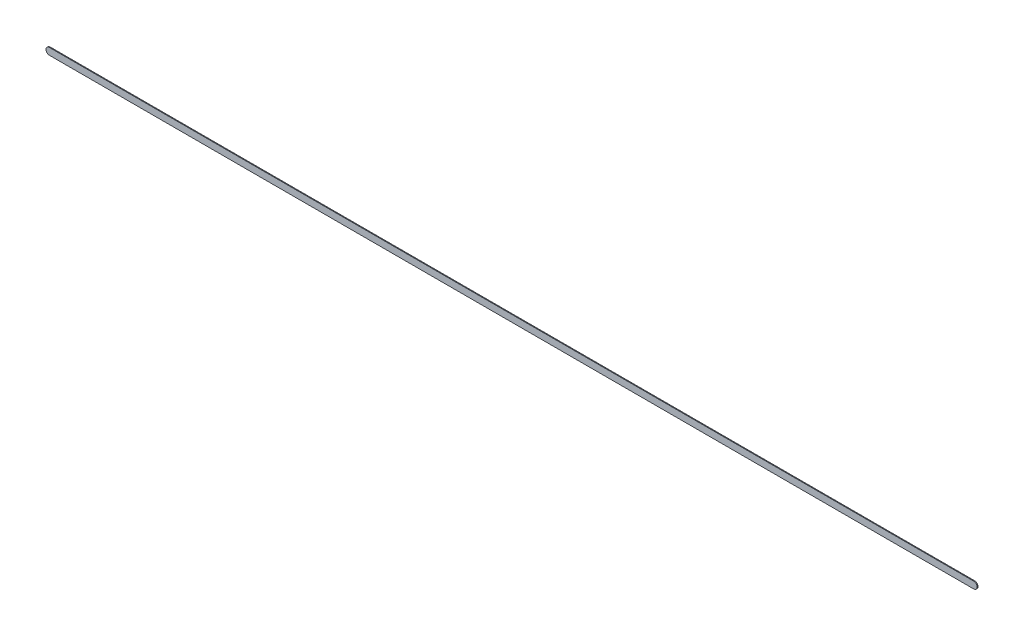
ISO-10303-21;
HEADER;
FILE_DESCRIPTION(('STEP AP214'),'2;1');
FILE_NAME('part.step','',(''),(''),'','','');
FILE_SCHEMA(('AUTOMOTIVE_DESIGN { 1 0 10303 214 1 1 1 1 }'));
ENDSEC;
DATA;
#1=APPLICATION_CONTEXT('core data for automotive mechanical design processes');
#2=APPLICATION_PROTOCOL_DEFINITION('international standard','automotive_design',2000,#1);
#3=PRODUCT_CONTEXT('',#1,'mechanical');
#4=PRODUCT('Part','Part','',(#3));
#5=PRODUCT_RELATED_PRODUCT_CATEGORY('part','',(#4));
#6=PRODUCT_DEFINITION_FORMATION('','',#4);
#7=PRODUCT_DEFINITION_CONTEXT('part definition',#1,'design');
#8=PRODUCT_DEFINITION('design','',#6,#7);
#9=PRODUCT_DEFINITION_SHAPE('','',#8);
#10=(LENGTH_UNIT() NAMED_UNIT(*) SI_UNIT(.MILLI.,.METRE.));
#11=(NAMED_UNIT(*) PLANE_ANGLE_UNIT() SI_UNIT($,.RADIAN.));
#12=(NAMED_UNIT(*) SI_UNIT($,.STERADIAN.) SOLID_ANGLE_UNIT());
#13=UNCERTAINTY_MEASURE_WITH_UNIT(LENGTH_MEASURE(1.E-05),#10,'distance_accuracy_value','');
#14=(GEOMETRIC_REPRESENTATION_CONTEXT(3) GLOBAL_UNCERTAINTY_ASSIGNED_CONTEXT((#13)) GLOBAL_UNIT_ASSIGNED_CONTEXT((#10,
#11,#12)) REPRESENTATION_CONTEXT('',''));
#15=CARTESIAN_POINT('',(0.,0.,0.));
#16=DIRECTION('',(0.,0.,1.));
#17=DIRECTION('',(1.,0.,0.));
#18=AXIS2_PLACEMENT_3D('',#15,#16,#17);
#19=CARTESIAN_POINT('',(118.93,-91.81,1.635));
#20=DIRECTION('',(0.,0.,1.));
#21=DIRECTION('',(1.,0.,0.));
#22=AXIS2_PLACEMENT_3D('',#19,#20,#21);
#23=PLANE('',#22);
#24=DIRECTION('',(-1.,0.,0.));
#25=VECTOR('',#24,1.);
#26=CARTESIAN_POINT('',(118.93,-91.81,1.635));
#27=LINE('',#26,#25);
#28=CARTESIAN_POINT('',(118.93,-91.81,1.635));
#29=VERTEX_POINT('',#28);
#30=CARTESIAN_POINT('',(78.23,-91.81,1.635));
#31=VERTEX_POINT('',#30);
#32=EDGE_CURVE('E81',#29,#31,#27,.T.);
#33=ORIENTED_EDGE('',*,*,#32,.T.);
#34=CARTESIAN_POINT('',(78.23,-91.96,1.635));
#35=DIRECTION('',(0.,0.,1.));
#36=DIRECTION('',(0.,1.,0.));
#37=AXIS2_PLACEMENT_3D('',#34,#35,#36);
#38=CIRCLE('',#37,0.15);
#39=CARTESIAN_POINT('',(78.23,-92.11,1.635));
#40=VERTEX_POINT('',#39);
#41=EDGE_CURVE('E108',#31,#40,#38,.T.);
#42=ORIENTED_EDGE('',*,*,#41,.T.);
#43=DIRECTION('',(1.,0.,0.));
#44=VECTOR('',#43,1.);
#45=CARTESIAN_POINT('',(78.23,-92.11,1.635));
#46=LINE('',#45,#44);
#47=CARTESIAN_POINT('',(118.93,-92.11,1.635));
#48=VERTEX_POINT('',#47);
#49=EDGE_CURVE('E74',#40,#48,#46,.T.);
#50=ORIENTED_EDGE('',*,*,#49,.T.);
#51=CARTESIAN_POINT('',(118.93,-91.96,1.635));
#52=DIRECTION('',(0.,0.,1.));
#53=DIRECTION('',(0.,-1.,0.));
#54=AXIS2_PLACEMENT_3D('',#51,#52,#53);
#55=CIRCLE('',#54,0.15);
#56=EDGE_CURVE('E11',#48,#29,#55,.T.);
#57=ORIENTED_EDGE('',*,*,#56,.T.);
#58=EDGE_LOOP('',(#33,#42,#50,#57));
#59=FACE_BOUND('',#58,.T.);
#60=ADVANCED_FACE('F17',(#59),#23,.T.);
#61=CARTESIAN_POINT('',(118.93,-91.81,1.6));
#62=DIRECTION('',(0.,0.,1.));
#63=DIRECTION('',(1.,0.,0.));
#64=AXIS2_PLACEMENT_3D('',#61,#62,#63);
#65=PLANE('',#64);
#66=CARTESIAN_POINT('',(118.93,-91.96,1.6));
#67=DIRECTION('',(0.,0.,1.));
#68=DIRECTION('',(0.,-1.,0.));
#69=AXIS2_PLACEMENT_3D('',#66,#67,#68);
#70=CIRCLE('',#69,0.15);
#71=CARTESIAN_POINT('',(118.93,-92.11,1.6));
#72=VERTEX_POINT('',#71);
#73=CARTESIAN_POINT('',(118.93,-91.81,1.6));
#74=VERTEX_POINT('',#73);
#75=EDGE_CURVE('E25',#72,#74,#70,.T.);
#76=ORIENTED_EDGE('',*,*,#75,.F.);
#77=DIRECTION('',(1.,0.,0.));
#78=VECTOR('',#77,1.);
#79=CARTESIAN_POINT('',(78.23,-92.11,1.6));
#80=LINE('',#79,#78);
#81=CARTESIAN_POINT('',(78.23,-92.11,1.6));
#82=VERTEX_POINT('',#81);
#83=EDGE_CURVE('E100',#82,#72,#80,.T.);
#84=ORIENTED_EDGE('',*,*,#83,.F.);
#85=CARTESIAN_POINT('',(78.23,-91.96,1.6));
#86=DIRECTION('',(0.,0.,1.));
#87=DIRECTION('',(0.,1.,0.));
#88=AXIS2_PLACEMENT_3D('',#85,#86,#87);
#89=CIRCLE('',#88,0.15);
#90=CARTESIAN_POINT('',(78.23,-91.81,1.6));
#91=VERTEX_POINT('',#90);
#92=EDGE_CURVE('E83',#91,#82,#89,.T.);
#93=ORIENTED_EDGE('',*,*,#92,.F.);
#94=DIRECTION('',(-1.,0.,0.));
#95=VECTOR('',#94,1.);
#96=CARTESIAN_POINT('',(118.93,-91.81,1.6));
#97=LINE('',#96,#95);
#98=EDGE_CURVE('E79',#74,#91,#97,.T.);
#99=ORIENTED_EDGE('',*,*,#98,.F.);
#100=EDGE_LOOP('',(#76,#84,#93,#99));
#101=FACE_BOUND('',#100,.T.);
#102=ADVANCED_FACE('F85',(#101),#65,.F.);
#103=CARTESIAN_POINT('',(118.93,-91.96,1.6));
#104=DIRECTION('',(0.,0.,-1.));
#105=DIRECTION('',(0.,-1.,0.));
#106=AXIS2_PLACEMENT_3D('',#103,#104,#105);
#107=CYLINDRICAL_SURFACE('',#106,0.15);
#108=ORIENTED_EDGE('',*,*,#75,.T.);
#109=DIRECTION('',(0.,0.,1.));
#110=VECTOR('',#109,1.);
#111=CARTESIAN_POINT('',(118.93,-91.81,1.6));
#112=LINE('',#111,#110);
#113=EDGE_CURVE('E68',#74,#29,#112,.T.);
#114=ORIENTED_EDGE('',*,*,#113,.T.);
#115=ORIENTED_EDGE('',*,*,#56,.F.);
#116=DIRECTION('',(0.,0.,1.));
#117=VECTOR('',#116,1.);
#118=CARTESIAN_POINT('',(118.93,-92.11,1.6));
#119=LINE('',#118,#117);
#120=EDGE_CURVE('E71',#72,#48,#119,.T.);
#121=ORIENTED_EDGE('',*,*,#120,.F.);
#122=EDGE_LOOP('',(#108,#114,#115,#121));
#123=FACE_BOUND('',#122,.T.);
#124=ADVANCED_FACE('F67',(#123),#107,.T.);
#125=CARTESIAN_POINT('',(78.23,-92.11,1.6));
#126=DIRECTION('',(0.,1.,0.));
#127=DIRECTION('',(1.,0.,0.));
#128=AXIS2_PLACEMENT_3D('',#125,#126,#127);
#129=PLANE('',#128);
#130=ORIENTED_EDGE('',*,*,#83,.T.);
#131=ORIENTED_EDGE('',*,*,#120,.T.);
#132=ORIENTED_EDGE('',*,*,#49,.F.);
#133=DIRECTION('',(0.,0.,1.));
#134=VECTOR('',#133,1.);
#135=CARTESIAN_POINT('',(78.23,-92.11,1.6));
#136=LINE('',#135,#134);
#137=EDGE_CURVE('E104',#82,#40,#136,.T.);
#138=ORIENTED_EDGE('',*,*,#137,.F.);
#139=EDGE_LOOP('',(#130,#131,#132,#138));
#140=FACE_BOUND('',#139,.T.);
#141=ADVANCED_FACE('F119',(#140),#129,.F.);
#142=CARTESIAN_POINT('',(78.23,-91.96,1.6));
#143=DIRECTION('',(0.,0.,-1.));
#144=DIRECTION('',(0.,1.,0.));
#145=AXIS2_PLACEMENT_3D('',#142,#143,#144);
#146=CYLINDRICAL_SURFACE('',#145,0.15);
#147=ORIENTED_EDGE('',*,*,#92,.T.);
#148=ORIENTED_EDGE('',*,*,#137,.T.);
#149=ORIENTED_EDGE('',*,*,#41,.F.);
#150=DIRECTION('',(0.,0.,1.));
#151=VECTOR('',#150,1.);
#152=CARTESIAN_POINT('',(78.23,-91.81,1.6));
#153=LINE('',#152,#151);
#154=EDGE_CURVE('E89',#91,#31,#153,.T.);
#155=ORIENTED_EDGE('',*,*,#154,.F.);
#156=EDGE_LOOP('',(#147,#148,#149,#155));
#157=FACE_BOUND('',#156,.T.);
#158=ADVANCED_FACE('F121',(#157),#146,.T.);
#159=CARTESIAN_POINT('',(118.93,-91.81,1.6));
#160=DIRECTION('',(0.,-1.,0.));
#161=DIRECTION('',(0.,0.,-1.));
#162=AXIS2_PLACEMENT_3D('',#159,#160,#161);
#163=PLANE('',#162);
#164=ORIENTED_EDGE('',*,*,#98,.T.);
#165=ORIENTED_EDGE('',*,*,#154,.T.);
#166=ORIENTED_EDGE('',*,*,#32,.F.);
#167=ORIENTED_EDGE('',*,*,#113,.F.);
#168=EDGE_LOOP('',(#164,#165,#166,#167));
#169=FACE_BOUND('',#168,.T.);
#170=ADVANCED_FACE('F77',(#169),#163,.F.);
#171=CLOSED_SHELL('',(#60,#102,#124,#141,#158,#170));
#172=MANIFOLD_SOLID_BREP('B1',#171);
#173=ADVANCED_BREP_SHAPE_REPRESENTATION('',(#18,#172),#14);
#174=SHAPE_DEFINITION_REPRESENTATION(#9,#173);
ENDSEC;
END-ISO-10303-21;
